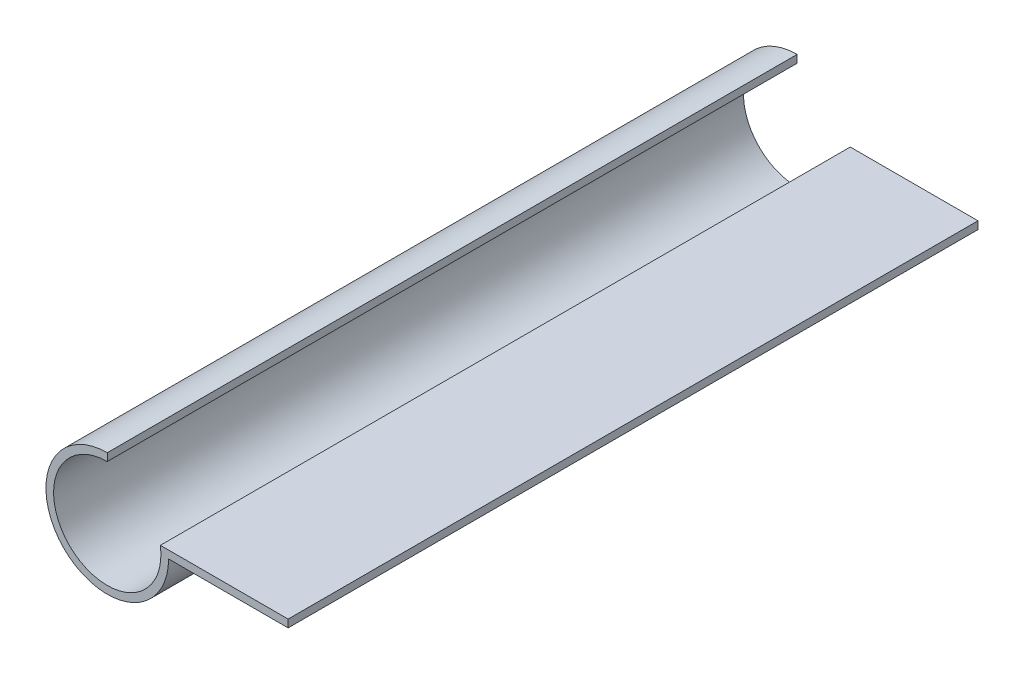
ISO-10303-21;
HEADER;
FILE_DESCRIPTION(('STEP AP214'),'2;1');
FILE_NAME('part.step','',(''),(''),'','','');
FILE_SCHEMA(('AUTOMOTIVE_DESIGN { 1 0 10303 214 1 1 1 1 }'));
ENDSEC;
DATA;
#1=APPLICATION_CONTEXT('core data for automotive mechanical design processes');
#2=APPLICATION_PROTOCOL_DEFINITION('international standard','automotive_design',2000,#1);
#3=PRODUCT_CONTEXT('',#1,'mechanical');
#4=PRODUCT('Part','Part','',(#3));
#5=PRODUCT_RELATED_PRODUCT_CATEGORY('part','',(#4));
#6=PRODUCT_DEFINITION_FORMATION('','',#4);
#7=PRODUCT_DEFINITION_CONTEXT('part definition',#1,'design');
#8=PRODUCT_DEFINITION('design','',#6,#7);
#9=PRODUCT_DEFINITION_SHAPE('','',#8);
#10=(LENGTH_UNIT() NAMED_UNIT(*) SI_UNIT(.MILLI.,.METRE.));
#11=(NAMED_UNIT(*) PLANE_ANGLE_UNIT() SI_UNIT($,.RADIAN.));
#12=(NAMED_UNIT(*) SI_UNIT($,.STERADIAN.) SOLID_ANGLE_UNIT());
#13=UNCERTAINTY_MEASURE_WITH_UNIT(LENGTH_MEASURE(1.E-05),#10,'distance_accuracy_value','');
#14=(GEOMETRIC_REPRESENTATION_CONTEXT(3) GLOBAL_UNCERTAINTY_ASSIGNED_CONTEXT((#13)) GLOBAL_UNIT_ASSIGNED_CONTEXT((#10,
#11,#12)) REPRESENTATION_CONTEXT('',''));
#15=CARTESIAN_POINT('',(0.,0.,0.));
#16=DIRECTION('',(0.,0.,1.));
#17=DIRECTION('',(1.,0.,0.));
#18=AXIS2_PLACEMENT_3D('',#15,#16,#17);
#19=CARTESIAN_POINT('',(0.,2.1,27.));
#20=DIRECTION('',(-1.,0.,0.));
#21=DIRECTION('',(0.,0.,1.));
#22=AXIS2_PLACEMENT_3D('',#19,#20,#21);
#23=PLANE('',#22);
#24=DIRECTION('',(0.,1.,0.));
#25=VECTOR('',#24,1.);
#26=CARTESIAN_POINT('',(0.,2.1,0.));
#27=LINE('',#26,#25);
#28=CARTESIAN_POINT('',(0.,2.1,0.));
#29=VERTEX_POINT('',#28);
#30=CARTESIAN_POINT('',(0.,2.4,0.));
#31=VERTEX_POINT('',#30);
#32=EDGE_CURVE('E123',#29,#31,#27,.T.);
#33=ORIENTED_EDGE('',*,*,#32,.T.);
#34=DIRECTION('',(0.,0.,-1.));
#35=VECTOR('',#34,1.);
#36=CARTESIAN_POINT('',(0.,2.4,27.));
#37=LINE('',#36,#35);
#38=CARTESIAN_POINT('',(0.,2.4,27.));
#39=VERTEX_POINT('',#38);
#40=EDGE_CURVE('E11',#39,#31,#37,.T.);
#41=ORIENTED_EDGE('',*,*,#40,.F.);
#42=DIRECTION('',(0.,1.,0.));
#43=VECTOR('',#42,1.);
#44=CARTESIAN_POINT('',(0.,2.1,27.));
#45=LINE('',#44,#43);
#46=CARTESIAN_POINT('',(0.,2.1,27.));
#47=VERTEX_POINT('',#46);
#48=EDGE_CURVE('E137',#47,#39,#45,.T.);
#49=ORIENTED_EDGE('',*,*,#48,.F.);
#50=DIRECTION('',(0.,0.,-1.));
#51=VECTOR('',#50,1.);
#52=CARTESIAN_POINT('',(0.,2.1,27.));
#53=LINE('',#52,#51);
#54=EDGE_CURVE('E55',#47,#29,#53,.T.);
#55=ORIENTED_EDGE('',*,*,#54,.T.);
#56=EDGE_LOOP('',(#33,#41,#49,#55));
#57=FACE_BOUND('',#56,.T.);
#58=ADVANCED_FACE('F39',(#57),#23,.F.);
#59=CARTESIAN_POINT('',(0.,0.,27.));
#60=DIRECTION('',(0.,0.,-1.));
#61=DIRECTION('',(-1.,0.,0.));
#62=AXIS2_PLACEMENT_3D('',#59,#60,#61);
#63=CYLINDRICAL_SURFACE('',#62,2.4);
#64=CARTESIAN_POINT('',(0.,0.,0.));
#65=DIRECTION('',(0.,0.,1.));
#66=DIRECTION('',(1.,0.,0.));
#67=AXIS2_PLACEMENT_3D('',#64,#65,#66);
#68=CIRCLE('',#67,2.4);
#69=CARTESIAN_POINT('',(2.4,0.,0.));
#70=VERTEX_POINT('',#69);
#71=EDGE_CURVE('E125',#31,#70,#68,.T.);
#72=ORIENTED_EDGE('',*,*,#71,.T.);
#73=DIRECTION('',(0.,0.,-1.));
#74=VECTOR('',#73,1.);
#75=CARTESIAN_POINT('',(2.4,0.,27.));
#76=LINE('',#75,#74);
#77=CARTESIAN_POINT('',(2.4,0.,27.));
#78=VERTEX_POINT('',#77);
#79=EDGE_CURVE('E47',#78,#70,#76,.T.);
#80=ORIENTED_EDGE('',*,*,#79,.F.);
#81=CARTESIAN_POINT('',(0.,0.,27.));
#82=DIRECTION('',(0.,0.,1.));
#83=DIRECTION('',(1.,0.,0.));
#84=AXIS2_PLACEMENT_3D('',#81,#82,#83);
#85=CIRCLE('',#84,2.4);
#86=EDGE_CURVE('E88',#39,#78,#85,.T.);
#87=ORIENTED_EDGE('',*,*,#86,.F.);
#88=ORIENTED_EDGE('',*,*,#40,.T.);
#89=EDGE_LOOP('',(#72,#80,#87,#88));
#90=FACE_BOUND('',#89,.T.);
#91=ADVANCED_FACE('F143',(#90),#63,.T.);
#92=CARTESIAN_POINT('',(7.07846096908265,0.,27.));
#93=DIRECTION('',(0.,-1.,0.));
#94=DIRECTION('',(1.,0.,0.));
#95=AXIS2_PLACEMENT_3D('',#92,#93,#94);
#96=PLANE('',#95);
#97=DIRECTION('',(-1.,0.,0.));
#98=VECTOR('',#97,1.);
#99=CARTESIAN_POINT('',(7.07846096908265,0.,0.));
#100=LINE('',#99,#98);
#101=CARTESIAN_POINT('',(7.07846096908265,0.,0.));
#102=VERTEX_POINT('',#101);
#103=EDGE_CURVE('E128',#102,#70,#100,.T.);
#104=ORIENTED_EDGE('',*,*,#103,.F.);
#105=DIRECTION('',(0.,0.,-1.));
#106=VECTOR('',#105,1.);
#107=CARTESIAN_POINT('',(7.07846096908265,0.,27.));
#108=LINE('',#107,#106);
#109=CARTESIAN_POINT('',(7.07846096908265,0.,27.));
#110=VERTEX_POINT('',#109);
#111=EDGE_CURVE('E115',#110,#102,#108,.T.);
#112=ORIENTED_EDGE('',*,*,#111,.F.);
#113=DIRECTION('',(-1.,0.,0.));
#114=VECTOR('',#113,1.);
#115=CARTESIAN_POINT('',(7.07846096908265,0.,27.));
#116=LINE('',#115,#114);
#117=EDGE_CURVE('E105',#110,#78,#116,.T.);
#118=ORIENTED_EDGE('',*,*,#117,.T.);
#119=ORIENTED_EDGE('',*,*,#79,.T.);
#120=EDGE_LOOP('',(#104,#112,#118,#119));
#121=FACE_BOUND('',#120,.T.);
#122=ADVANCED_FACE('F142',(#121),#96,.T.);
#123=CARTESIAN_POINT('',(7.07846096908265,0.,27.));
#124=DIRECTION('',(-1.,0.,0.));
#125=DIRECTION('',(0.,0.,1.));
#126=AXIS2_PLACEMENT_3D('',#123,#124,#125);
#127=PLANE('',#126);
#128=DIRECTION('',(0.,1.,0.));
#129=VECTOR('',#128,1.);
#130=CARTESIAN_POINT('',(7.07846096908265,0.,0.));
#131=LINE('',#130,#129);
#132=CARTESIAN_POINT('',(7.07846096908265,0.3,0.));
#133=VERTEX_POINT('',#132);
#134=EDGE_CURVE('E112',#102,#133,#131,.T.);
#135=ORIENTED_EDGE('',*,*,#134,.T.);
#136=DIRECTION('',(0.,0.,-1.));
#137=VECTOR('',#136,1.);
#138=CARTESIAN_POINT('',(7.07846096908265,0.3,27.));
#139=LINE('',#138,#137);
#140=CARTESIAN_POINT('',(7.07846096908265,0.3,27.));
#141=VERTEX_POINT('',#140);
#142=EDGE_CURVE('E109',#141,#133,#139,.T.);
#143=ORIENTED_EDGE('',*,*,#142,.F.);
#144=DIRECTION('',(0.,1.,0.));
#145=VECTOR('',#144,1.);
#146=CARTESIAN_POINT('',(7.07846096908265,0.,27.));
#147=LINE('',#146,#145);
#148=EDGE_CURVE('E98',#110,#141,#147,.T.);
#149=ORIENTED_EDGE('',*,*,#148,.F.);
#150=ORIENTED_EDGE('',*,*,#111,.T.);
#151=EDGE_LOOP('',(#135,#143,#149,#150));
#152=FACE_BOUND('',#151,.T.);
#153=ADVANCED_FACE('F110',(#152),#127,.F.);
#154=CARTESIAN_POINT('',(7.07846096908265,0.3,27.));
#155=DIRECTION('',(0.,-1.,0.));
#156=DIRECTION('',(1.,0.,0.));
#157=AXIS2_PLACEMENT_3D('',#154,#155,#156);
#158=PLANE('',#157);
#159=DIRECTION('',(-1.,0.,0.));
#160=VECTOR('',#159,1.);
#161=CARTESIAN_POINT('',(7.07846096908265,0.3,0.));
#162=LINE('',#161,#160);
#163=CARTESIAN_POINT('',(2.07846096908265,0.299999999999999,0.));
#164=VERTEX_POINT('',#163);
#165=EDGE_CURVE('E132',#133,#164,#162,.T.);
#166=ORIENTED_EDGE('',*,*,#165,.T.);
#167=DIRECTION('',(0.,0.,-1.));
#168=VECTOR('',#167,1.);
#169=CARTESIAN_POINT('',(2.07846096908265,0.299999999999999,27.));
#170=LINE('',#169,#168);
#171=CARTESIAN_POINT('',(2.07846096908265,0.299999999999999,27.));
#172=VERTEX_POINT('',#171);
#173=EDGE_CURVE('E76',#172,#164,#170,.T.);
#174=ORIENTED_EDGE('',*,*,#173,.F.);
#175=DIRECTION('',(-1.,0.,0.));
#176=VECTOR('',#175,1.);
#177=CARTESIAN_POINT('',(7.07846096908265,0.3,27.));
#178=LINE('',#177,#176);
#179=EDGE_CURVE('E103',#141,#172,#178,.T.);
#180=ORIENTED_EDGE('',*,*,#179,.F.);
#181=ORIENTED_EDGE('',*,*,#142,.T.);
#182=EDGE_LOOP('',(#166,#174,#180,#181));
#183=FACE_BOUND('',#182,.T.);
#184=ADVANCED_FACE('F117',(#183),#158,.F.);
#185=CARTESIAN_POINT('',(0.,0.,27.));
#186=DIRECTION('',(0.,0.,-1.));
#187=DIRECTION('',(-1.,0.,0.));
#188=AXIS2_PLACEMENT_3D('',#185,#186,#187);
#189=CYLINDRICAL_SURFACE('',#188,2.1);
#190=CARTESIAN_POINT('',(0.,0.,0.));
#191=DIRECTION('',(0.,0.,1.));
#192=DIRECTION('',(1.,0.,0.));
#193=AXIS2_PLACEMENT_3D('',#190,#191,#192);
#194=CIRCLE('',#193,2.1);
#195=EDGE_CURVE('E134',#29,#164,#194,.T.);
#196=ORIENTED_EDGE('',*,*,#195,.F.);
#197=ORIENTED_EDGE('',*,*,#54,.F.);
#198=CARTESIAN_POINT('',(0.,0.,27.));
#199=DIRECTION('',(0.,0.,1.));
#200=DIRECTION('',(1.,0.,0.));
#201=AXIS2_PLACEMENT_3D('',#198,#199,#200);
#202=CIRCLE('',#201,2.1);
#203=EDGE_CURVE('E118',#47,#172,#202,.T.);
#204=ORIENTED_EDGE('',*,*,#203,.T.);
#205=ORIENTED_EDGE('',*,*,#173,.T.);
#206=EDGE_LOOP('',(#196,#197,#204,#205));
#207=FACE_BOUND('',#206,.T.);
#208=ADVANCED_FACE('F147',(#207),#189,.F.);
#209=CARTESIAN_POINT('',(0.,0.,27.));
#210=DIRECTION('',(0.,0.,1.));
#211=DIRECTION('',(1.,0.,0.));
#212=AXIS2_PLACEMENT_3D('',#209,#210,#211);
#213=PLANE('',#212);
#214=ORIENTED_EDGE('',*,*,#48,.T.);
#215=ORIENTED_EDGE('',*,*,#86,.T.);
#216=ORIENTED_EDGE('',*,*,#117,.F.);
#217=ORIENTED_EDGE('',*,*,#148,.T.);
#218=ORIENTED_EDGE('',*,*,#179,.T.);
#219=ORIENTED_EDGE('',*,*,#203,.F.);
#220=EDGE_LOOP('',(#214,#215,#216,#217,#218,#219));
#221=FACE_BOUND('',#220,.T.);
#222=ADVANCED_FACE('F100',(#221),#213,.T.);
#223=CARTESIAN_POINT('',(0.,0.,0.));
#224=DIRECTION('',(0.,0.,1.));
#225=DIRECTION('',(1.,0.,0.));
#226=AXIS2_PLACEMENT_3D('',#223,#224,#225);
#227=PLANE('',#226);
#228=ORIENTED_EDGE('',*,*,#32,.F.);
#229=ORIENTED_EDGE('',*,*,#195,.T.);
#230=ORIENTED_EDGE('',*,*,#165,.F.);
#231=ORIENTED_EDGE('',*,*,#134,.F.);
#232=ORIENTED_EDGE('',*,*,#103,.T.);
#233=ORIENTED_EDGE('',*,*,#71,.F.);
#234=EDGE_LOOP('',(#228,#229,#230,#231,#232,#233));
#235=FACE_BOUND('',#234,.T.);
#236=ADVANCED_FACE('F146',(#235),#227,.F.);
#237=CLOSED_SHELL('',(#58,#91,#122,#153,#184,#208,#222,#236));
#238=MANIFOLD_SOLID_BREP('B2',#237);
#239=ADVANCED_BREP_SHAPE_REPRESENTATION('',(#18,#238),#14);
#240=SHAPE_DEFINITION_REPRESENTATION(#9,#239);
ENDSEC;
END-ISO-10303-21;
